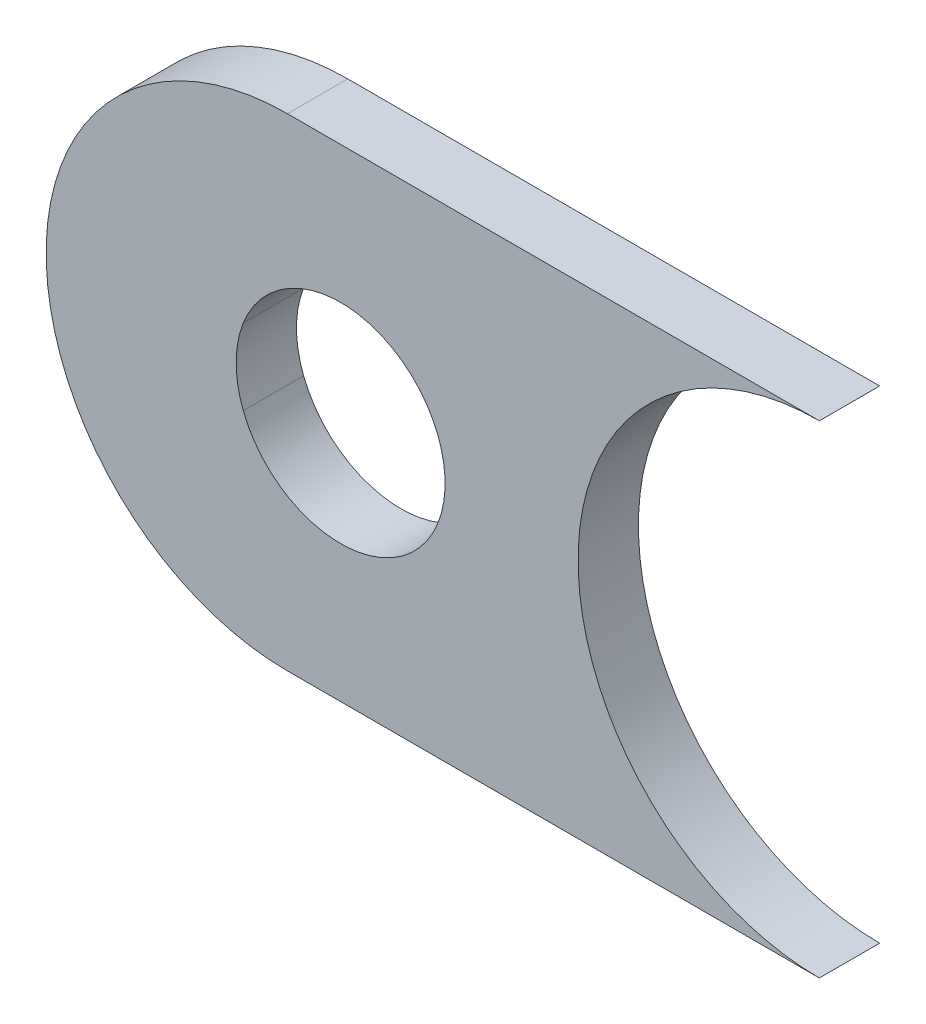
ISO-10303-21;
HEADER;
FILE_DESCRIPTION(('STEP AP214'),'2;1');
FILE_NAME('part.step','',(''),(''),'','','');
FILE_SCHEMA(('AUTOMOTIVE_DESIGN { 1 0 10303 214 1 1 1 1 }'));
ENDSEC;
DATA;
#1=APPLICATION_CONTEXT('core data for automotive mechanical design processes');
#2=APPLICATION_PROTOCOL_DEFINITION('international standard','automotive_design',2000,#1);
#3=PRODUCT_CONTEXT('',#1,'mechanical');
#4=PRODUCT('Part','Part','',(#3));
#5=PRODUCT_RELATED_PRODUCT_CATEGORY('part','',(#4));
#6=PRODUCT_DEFINITION_FORMATION('','',#4);
#7=PRODUCT_DEFINITION_CONTEXT('part definition',#1,'design');
#8=PRODUCT_DEFINITION('design','',#6,#7);
#9=PRODUCT_DEFINITION_SHAPE('','',#8);
#10=(LENGTH_UNIT() NAMED_UNIT(*) SI_UNIT(.MILLI.,.METRE.));
#11=(NAMED_UNIT(*) PLANE_ANGLE_UNIT() SI_UNIT($,.RADIAN.));
#12=(NAMED_UNIT(*) SI_UNIT($,.STERADIAN.) SOLID_ANGLE_UNIT());
#13=UNCERTAINTY_MEASURE_WITH_UNIT(LENGTH_MEASURE(1.E-05),#10,'distance_accuracy_value','');
#14=(GEOMETRIC_REPRESENTATION_CONTEXT(3) GLOBAL_UNCERTAINTY_ASSIGNED_CONTEXT((#13)) GLOBAL_UNIT_ASSIGNED_CONTEXT((#10,
#11,#12)) REPRESENTATION_CONTEXT('',''));
#15=CARTESIAN_POINT('',(0.,0.,0.));
#16=DIRECTION('',(0.,0.,1.));
#17=DIRECTION('',(1.,0.,0.));
#18=AXIS2_PLACEMENT_3D('',#15,#16,#17);
#19=CARTESIAN_POINT('',(-25.2,0.,3.175));
#20=DIRECTION('',(0.,0.,-1.));
#21=DIRECTION('',(-1.,0.,0.));
#22=AXIS2_PLACEMENT_3D('',#19,#20,#21);
#23=CYLINDRICAL_SURFACE('',#22,5.5);
#24=CARTESIAN_POINT('',(-25.2,0.,3.175));
#25=DIRECTION('',(0.,0.,1.));
#26=DIRECTION('',(1.,0.,0.));
#27=AXIS2_PLACEMENT_3D('',#24,#25,#26);
#28=CIRCLE('',#27,5.5);
#29=CARTESIAN_POINT('',(-30.3234753829798,-2.,3.175));
#30=VERTEX_POINT('',#29);
#31=CARTESIAN_POINT('',(-20.0765246170202,-2.,3.175));
#32=VERTEX_POINT('',#31);
#33=EDGE_CURVE('E171',#30,#32,#28,.T.);
#34=ORIENTED_EDGE('',*,*,#33,.T.);
#35=DIRECTION('',(0.,0.,-1.));
#36=VECTOR('',#35,1.);
#37=CARTESIAN_POINT('',(-20.0765246170202,-2.,3.175));
#38=LINE('',#37,#36);
#39=CARTESIAN_POINT('',(-20.0765246170202,-2.,0.));
#40=VERTEX_POINT('',#39);
#41=EDGE_CURVE('E11',#32,#40,#38,.T.);
#42=ORIENTED_EDGE('',*,*,#41,.T.);
#43=CARTESIAN_POINT('',(-25.2,0.,0.));
#44=DIRECTION('',(0.,0.,1.));
#45=DIRECTION('',(1.,0.,0.));
#46=AXIS2_PLACEMENT_3D('',#43,#44,#45);
#47=CIRCLE('',#46,5.5);
#48=CARTESIAN_POINT('',(-30.3234753829798,-2.,0.));
#49=VERTEX_POINT('',#48);
#50=EDGE_CURVE('E161',#49,#40,#47,.T.);
#51=ORIENTED_EDGE('',*,*,#50,.F.);
#52=DIRECTION('',(0.,0.,-1.));
#53=VECTOR('',#52,1.);
#54=CARTESIAN_POINT('',(-30.3234753829798,-2.,3.175));
#55=LINE('',#54,#53);
#56=EDGE_CURVE('E57',#49,#30,#55,.F.);
#57=ORIENTED_EDGE('',*,*,#56,.T.);
#58=EDGE_LOOP('',(#34,#42,#51,#57));
#59=FACE_BOUND('',#58,.T.);
#60=ADVANCED_FACE('F47',(#59),#23,.F.);
#61=ORIENTED_EDGE('',*,*,#41,.F.);
#62=CARTESIAN_POINT('',(-20.0765246170202,2.,3.175));
#63=VERTEX_POINT('',#62);
#64=EDGE_CURVE('E176',#32,#63,#28,.T.);
#65=ORIENTED_EDGE('',*,*,#64,.T.);
#66=DIRECTION('',(0.,0.,-1.));
#67=VECTOR('',#66,1.);
#68=CARTESIAN_POINT('',(-20.0765246170202,2.,3.175));
#69=LINE('',#68,#67);
#70=CARTESIAN_POINT('',(-20.0765246170202,2.,0.));
#71=VERTEX_POINT('',#70);
#72=EDGE_CURVE('E51',#71,#63,#69,.F.);
#73=ORIENTED_EDGE('',*,*,#72,.F.);
#74=EDGE_CURVE('E166',#40,#71,#47,.T.);
#75=ORIENTED_EDGE('',*,*,#74,.F.);
#76=EDGE_LOOP('',(#61,#65,#73,#75));
#77=FACE_BOUND('',#76,.T.);
#78=ADVANCED_FACE('F204',(#77),#23,.F.);
#79=CARTESIAN_POINT('',(-30.3234753829798,2.,3.175));
#80=VERTEX_POINT('',#79);
#81=EDGE_CURVE('E133',#63,#80,#28,.T.);
#82=ORIENTED_EDGE('',*,*,#81,.T.);
#83=DIRECTION('',(0.,0.,-1.));
#84=VECTOR('',#83,1.);
#85=CARTESIAN_POINT('',(-30.3234753829798,2.,3.175));
#86=LINE('',#85,#84);
#87=CARTESIAN_POINT('',(-30.3234753829798,2.,0.));
#88=VERTEX_POINT('',#87);
#89=EDGE_CURVE('E140',#80,#88,#86,.T.);
#90=ORIENTED_EDGE('',*,*,#89,.T.);
#91=EDGE_CURVE('E154',#71,#88,#47,.T.);
#92=ORIENTED_EDGE('',*,*,#91,.F.);
#93=ORIENTED_EDGE('',*,*,#72,.T.);
#94=EDGE_LOOP('',(#82,#90,#92,#93));
#95=FACE_BOUND('',#94,.T.);
#96=ADVANCED_FACE('F152',(#95),#23,.F.);
#97=CARTESIAN_POINT('',(0.,12.7,3.175));
#98=DIRECTION('',(0.,-1.,0.));
#99=DIRECTION('',(1.,0.,0.));
#100=AXIS2_PLACEMENT_3D('',#97,#98,#99);
#101=PLANE('',#100);
#102=DIRECTION('',(-1.,0.,0.));
#103=VECTOR('',#102,1.);
#104=CARTESIAN_POINT('',(0.,12.7,0.));
#105=LINE('',#104,#103);
#106=CARTESIAN_POINT('',(0.,12.7,0.));
#107=VERTEX_POINT('',#106);
#108=CARTESIAN_POINT('',(-28.,12.7,0.));
#109=VERTEX_POINT('',#108);
#110=EDGE_CURVE('E137',#107,#109,#105,.T.);
#111=ORIENTED_EDGE('',*,*,#110,.T.);
#112=DIRECTION('',(0.,0.,-1.));
#113=VECTOR('',#112,1.);
#114=CARTESIAN_POINT('',(-28.,12.7,3.175));
#115=LINE('',#114,#113);
#116=CARTESIAN_POINT('',(-28.,12.7,3.175));
#117=VERTEX_POINT('',#116);
#118=EDGE_CURVE('E118',#117,#109,#115,.T.);
#119=ORIENTED_EDGE('',*,*,#118,.F.);
#120=DIRECTION('',(-1.,0.,0.));
#121=VECTOR('',#120,1.);
#122=CARTESIAN_POINT('',(0.,12.7,3.175));
#123=LINE('',#122,#121);
#124=CARTESIAN_POINT('',(0.,12.7,3.175));
#125=VERTEX_POINT('',#124);
#126=EDGE_CURVE('E125',#125,#117,#123,.T.);
#127=ORIENTED_EDGE('',*,*,#126,.F.);
#128=DIRECTION('',(0.,0.,-1.));
#129=VECTOR('',#128,1.);
#130=CARTESIAN_POINT('',(0.,12.7,3.175));
#131=LINE('',#130,#129);
#132=EDGE_CURVE('E179',#125,#107,#131,.T.);
#133=ORIENTED_EDGE('',*,*,#132,.T.);
#134=EDGE_LOOP('',(#111,#119,#127,#133));
#135=FACE_BOUND('',#134,.T.);
#136=ADVANCED_FACE('F135',(#135),#101,.F.);
#137=CARTESIAN_POINT('',(-28.,0.,3.175));
#138=DIRECTION('',(0.,0.,-1.));
#139=DIRECTION('',(-1.,0.,0.));
#140=AXIS2_PLACEMENT_3D('',#137,#138,#139);
#141=CYLINDRICAL_SURFACE('',#140,12.7);
#142=CARTESIAN_POINT('',(-28.,0.,0.));
#143=DIRECTION('',(0.,0.,1.));
#144=DIRECTION('',(1.,0.,0.));
#145=AXIS2_PLACEMENT_3D('',#142,#143,#144);
#146=CIRCLE('',#145,12.7);
#147=CARTESIAN_POINT('',(-28.,-12.7,0.));
#148=VERTEX_POINT('',#147);
#149=EDGE_CURVE('E167',#109,#148,#146,.T.);
#150=ORIENTED_EDGE('',*,*,#149,.T.);
#151=DIRECTION('',(0.,0.,-1.));
#152=VECTOR('',#151,1.);
#153=CARTESIAN_POINT('',(-28.,-12.7,3.175));
#154=LINE('',#153,#152);
#155=CARTESIAN_POINT('',(-28.,-12.7,3.175));
#156=VERTEX_POINT('',#155);
#157=EDGE_CURVE('E120',#156,#148,#154,.T.);
#158=ORIENTED_EDGE('',*,*,#157,.F.);
#159=CARTESIAN_POINT('',(-28.,0.,3.175));
#160=DIRECTION('',(0.,0.,1.));
#161=DIRECTION('',(1.,0.,0.));
#162=AXIS2_PLACEMENT_3D('',#159,#160,#161);
#163=CIRCLE('',#162,12.7);
#164=EDGE_CURVE('E113',#117,#156,#163,.T.);
#165=ORIENTED_EDGE('',*,*,#164,.F.);
#166=ORIENTED_EDGE('',*,*,#118,.T.);
#167=EDGE_LOOP('',(#150,#158,#165,#166));
#168=FACE_BOUND('',#167,.T.);
#169=ADVANCED_FACE('F116',(#168),#141,.T.);
#170=CARTESIAN_POINT('',(0.,-12.7,3.175));
#171=DIRECTION('',(0.,-1.,0.));
#172=DIRECTION('',(1.,0.,0.));
#173=AXIS2_PLACEMENT_3D('',#170,#171,#172);
#174=PLANE('',#173);
#175=DIRECTION('',(-1.,0.,0.));
#176=VECTOR('',#175,1.);
#177=CARTESIAN_POINT('',(0.,-12.7,0.));
#178=LINE('',#177,#176);
#179=CARTESIAN_POINT('',(0.,-12.7,0.));
#180=VERTEX_POINT('',#179);
#181=EDGE_CURVE('E186',#180,#148,#178,.T.);
#182=ORIENTED_EDGE('',*,*,#181,.F.);
#183=DIRECTION('',(0.,0.,-1.));
#184=VECTOR('',#183,1.);
#185=CARTESIAN_POINT('',(0.,-12.7,3.175));
#186=LINE('',#185,#184);
#187=CARTESIAN_POINT('',(0.,-12.7,3.175));
#188=VERTEX_POINT('',#187);
#189=EDGE_CURVE('E141',#188,#180,#186,.T.);
#190=ORIENTED_EDGE('',*,*,#189,.F.);
#191=DIRECTION('',(-1.,0.,0.));
#192=VECTOR('',#191,1.);
#193=CARTESIAN_POINT('',(0.,-12.7,3.175));
#194=LINE('',#193,#192);
#195=EDGE_CURVE('E124',#188,#156,#194,.T.);
#196=ORIENTED_EDGE('',*,*,#195,.T.);
#197=ORIENTED_EDGE('',*,*,#157,.T.);
#198=EDGE_LOOP('',(#182,#190,#196,#197));
#199=FACE_BOUND('',#198,.T.);
#200=ADVANCED_FACE('F192',(#199),#174,.T.);
#201=ORIENTED_EDGE('',*,*,#56,.F.);
#202=EDGE_CURVE('E158',#88,#49,#47,.T.);
#203=ORIENTED_EDGE('',*,*,#202,.F.);
#204=ORIENTED_EDGE('',*,*,#89,.F.);
#205=EDGE_CURVE('E174',#80,#30,#28,.T.);
#206=ORIENTED_EDGE('',*,*,#205,.T.);
#207=EDGE_LOOP('',(#201,#203,#204,#206));
#208=FACE_BOUND('',#207,.T.);
#209=ADVANCED_FACE('F49',(#208),#23,.F.);
#210=CARTESIAN_POINT('',(0.,0.,3.175));
#211=DIRECTION('',(0.,0.,-1.));
#212=DIRECTION('',(-1.,0.,0.));
#213=AXIS2_PLACEMENT_3D('',#210,#211,#212);
#214=CYLINDRICAL_SURFACE('',#213,12.7);
#215=CARTESIAN_POINT('',(0.,0.,0.));
#216=DIRECTION('',(0.,0.,1.));
#217=DIRECTION('',(1.,0.,0.));
#218=AXIS2_PLACEMENT_3D('',#215,#216,#217);
#219=CIRCLE('',#218,12.7);
#220=EDGE_CURVE('E183',#107,#180,#219,.T.);
#221=ORIENTED_EDGE('',*,*,#220,.F.);
#222=ORIENTED_EDGE('',*,*,#132,.F.);
#223=CARTESIAN_POINT('',(0.,0.,3.175));
#224=DIRECTION('',(0.,0.,1.));
#225=DIRECTION('',(1.,0.,0.));
#226=AXIS2_PLACEMENT_3D('',#223,#224,#225);
#227=CIRCLE('',#226,12.7);
#228=EDGE_CURVE('E131',#125,#188,#227,.T.);
#229=ORIENTED_EDGE('',*,*,#228,.T.);
#230=ORIENTED_EDGE('',*,*,#189,.T.);
#231=EDGE_LOOP('',(#221,#222,#229,#230));
#232=FACE_BOUND('',#231,.T.);
#233=ADVANCED_FACE('F193',(#232),#214,.F.);
#234=CARTESIAN_POINT('',(0.,0.,3.175));
#235=DIRECTION('',(0.,0.,1.));
#236=DIRECTION('',(1.,0.,0.));
#237=AXIS2_PLACEMENT_3D('',#234,#235,#236);
#238=PLANE('',#237);
#239=ORIENTED_EDGE('',*,*,#81,.F.);
#240=ORIENTED_EDGE('',*,*,#64,.F.);
#241=ORIENTED_EDGE('',*,*,#33,.F.);
#242=ORIENTED_EDGE('',*,*,#205,.F.);
#243=EDGE_LOOP('',(#239,#240,#241,#242));
#244=FACE_BOUND('',#243,.T.);
#245=ORIENTED_EDGE('',*,*,#126,.T.);
#246=ORIENTED_EDGE('',*,*,#164,.T.);
#247=ORIENTED_EDGE('',*,*,#195,.F.);
#248=ORIENTED_EDGE('',*,*,#228,.F.);
#249=EDGE_LOOP('',(#245,#246,#247,#248));
#250=FACE_BOUND('',#249,.T.);
#251=ADVANCED_FACE('F129',(#244,#250),#238,.T.);
#252=CARTESIAN_POINT('',(0.,0.,0.));
#253=DIRECTION('',(0.,0.,1.));
#254=DIRECTION('',(1.,0.,0.));
#255=AXIS2_PLACEMENT_3D('',#252,#253,#254);
#256=PLANE('',#255);
#257=ORIENTED_EDGE('',*,*,#91,.T.);
#258=ORIENTED_EDGE('',*,*,#202,.T.);
#259=ORIENTED_EDGE('',*,*,#50,.T.);
#260=ORIENTED_EDGE('',*,*,#74,.T.);
#261=EDGE_LOOP('',(#257,#258,#259,#260));
#262=FACE_BOUND('',#261,.T.);
#263=ORIENTED_EDGE('',*,*,#110,.F.);
#264=ORIENTED_EDGE('',*,*,#220,.T.);
#265=ORIENTED_EDGE('',*,*,#181,.T.);
#266=ORIENTED_EDGE('',*,*,#149,.F.);
#267=EDGE_LOOP('',(#263,#264,#265,#266));
#268=FACE_BOUND('',#267,.T.);
#269=ADVANCED_FACE('F164',(#262,#268),#256,.F.);
#270=CLOSED_SHELL('',(#60,#78,#96,#136,#169,#200,#209,#233,#251,#269));
#271=MANIFOLD_SOLID_BREP('B2',#270);
#272=ADVANCED_BREP_SHAPE_REPRESENTATION('',(#18,#271),#14);
#273=SHAPE_DEFINITION_REPRESENTATION(#9,#272);
ENDSEC;
END-ISO-10303-21;
